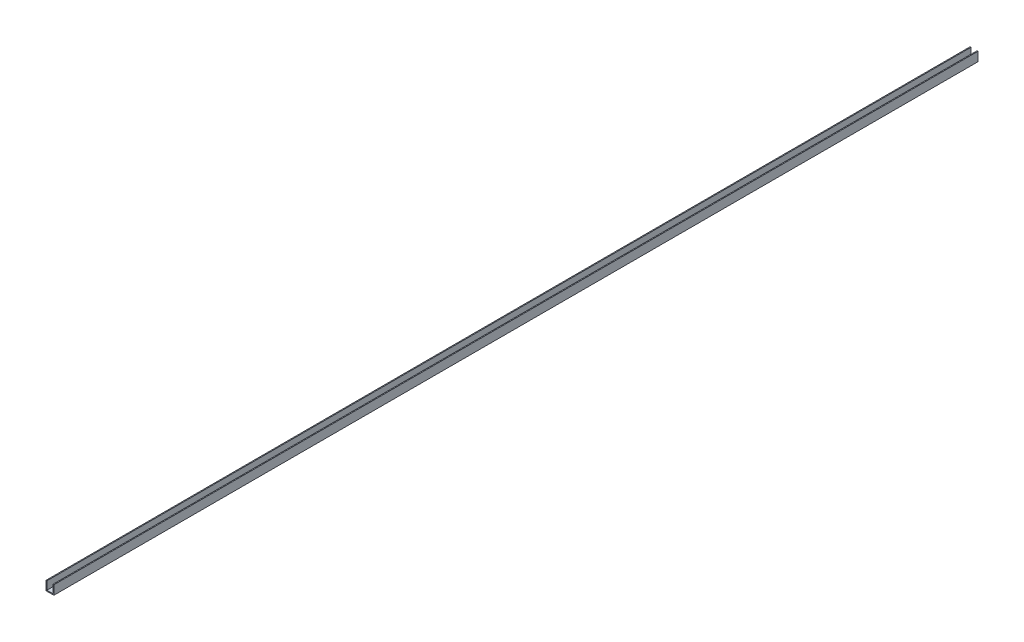
ISO-10303-21;
HEADER;
FILE_DESCRIPTION(('STEP AP214'),'2;1');
FILE_NAME('part.step','',(''),(''),'','','');
FILE_SCHEMA(('AUTOMOTIVE_DESIGN { 1 0 10303 214 1 1 1 1 }'));
ENDSEC;
DATA;
#1=APPLICATION_CONTEXT('core data for automotive mechanical design processes');
#2=APPLICATION_PROTOCOL_DEFINITION('international standard','automotive_design',2000,#1);
#3=PRODUCT_CONTEXT('',#1,'mechanical');
#4=PRODUCT('Part','Part','',(#3));
#5=PRODUCT_RELATED_PRODUCT_CATEGORY('part','',(#4));
#6=PRODUCT_DEFINITION_FORMATION('','',#4);
#7=PRODUCT_DEFINITION_CONTEXT('part definition',#1,'design');
#8=PRODUCT_DEFINITION('design','',#6,#7);
#9=PRODUCT_DEFINITION_SHAPE('','',#8);
#10=(LENGTH_UNIT() NAMED_UNIT(*) SI_UNIT(.MILLI.,.METRE.));
#11=(NAMED_UNIT(*) PLANE_ANGLE_UNIT() SI_UNIT($,.RADIAN.));
#12=(NAMED_UNIT(*) SI_UNIT($,.STERADIAN.) SOLID_ANGLE_UNIT());
#13=UNCERTAINTY_MEASURE_WITH_UNIT(LENGTH_MEASURE(1.E-05),#10,'distance_accuracy_value','');
#14=(GEOMETRIC_REPRESENTATION_CONTEXT(3) GLOBAL_UNCERTAINTY_ASSIGNED_CONTEXT((#13)) GLOBAL_UNIT_ASSIGNED_CONTEXT((#10,
#11,#12)) REPRESENTATION_CONTEXT('',''));
#15=CARTESIAN_POINT('',(0.,0.,0.));
#16=DIRECTION('',(0.,0.,1.));
#17=DIRECTION('',(1.,0.,0.));
#18=AXIS2_PLACEMENT_3D('',#15,#16,#17);
#19=CARTESIAN_POINT('',(-4.953,7.493,762.));
#20=DIRECTION('',(0.,-1.,0.));
#21=DIRECTION('',(1.,0.,0.));
#22=AXIS2_PLACEMENT_3D('',#19,#20,#21);
#23=PLANE('',#22);
#24=DIRECTION('',(-1.,0.,0.));
#25=VECTOR('',#24,1.);
#26=CARTESIAN_POINT('',(-4.953,7.493,-762.));
#27=LINE('',#26,#25);
#28=CARTESIAN_POINT('',(-4.953,7.493,-762.));
#29=VERTEX_POINT('',#28);
#30=CARTESIAN_POINT('',(-6.477,7.493,-762.));
#31=VERTEX_POINT('',#30);
#32=EDGE_CURVE('E128',#29,#31,#27,.T.);
#33=ORIENTED_EDGE('',*,*,#32,.T.);
#34=DIRECTION('',(0.,0.,-1.));
#35=VECTOR('',#34,1.);
#36=CARTESIAN_POINT('',(-6.477,7.493,762.));
#37=LINE('',#36,#35);
#38=CARTESIAN_POINT('',(-6.477,7.493,762.));
#39=VERTEX_POINT('',#38);
#40=EDGE_CURVE('E11',#39,#31,#37,.T.);
#41=ORIENTED_EDGE('',*,*,#40,.F.);
#42=DIRECTION('',(-1.,0.,0.));
#43=VECTOR('',#42,1.);
#44=CARTESIAN_POINT('',(-4.953,7.493,762.));
#45=LINE('',#44,#43);
#46=CARTESIAN_POINT('',(-4.953,7.493,762.));
#47=VERTEX_POINT('',#46);
#48=EDGE_CURVE('E142',#47,#39,#45,.T.);
#49=ORIENTED_EDGE('',*,*,#48,.F.);
#50=DIRECTION('',(0.,0.,-1.));
#51=VECTOR('',#50,1.);
#52=CARTESIAN_POINT('',(-4.953,7.493,762.));
#53=LINE('',#52,#51);
#54=EDGE_CURVE('E124',#47,#29,#53,.T.);
#55=ORIENTED_EDGE('',*,*,#54,.T.);
#56=EDGE_LOOP('',(#33,#41,#49,#55));
#57=FACE_BOUND('',#56,.T.);
#58=ADVANCED_FACE('F32',(#57),#23,.F.);
#59=CARTESIAN_POINT('',(-6.477,7.493,762.));
#60=DIRECTION('',(1.,0.,0.));
#61=DIRECTION('',(0.,1.,0.));
#62=AXIS2_PLACEMENT_3D('',#59,#60,#61);
#63=PLANE('',#62);
#64=DIRECTION('',(0.,-1.,0.));
#65=VECTOR('',#64,1.);
#66=CARTESIAN_POINT('',(-6.477,7.493,-762.));
#67=LINE('',#66,#65);
#68=CARTESIAN_POINT('',(-6.477,-7.493,-762.));
#69=VERTEX_POINT('',#68);
#70=EDGE_CURVE('E131',#31,#69,#67,.T.);
#71=ORIENTED_EDGE('',*,*,#70,.T.);
#72=DIRECTION('',(0.,0.,-1.));
#73=VECTOR('',#72,1.);
#74=CARTESIAN_POINT('',(-6.477,-7.493,762.));
#75=LINE('',#74,#73);
#76=CARTESIAN_POINT('',(-6.477,-7.493,762.));
#77=VERTEX_POINT('',#76);
#78=EDGE_CURVE('E40',#77,#69,#75,.T.);
#79=ORIENTED_EDGE('',*,*,#78,.F.);
#80=DIRECTION('',(0.,-1.,0.));
#81=VECTOR('',#80,1.);
#82=CARTESIAN_POINT('',(-6.477,7.493,762.));
#83=LINE('',#82,#81);
#84=EDGE_CURVE('E91',#39,#77,#83,.T.);
#85=ORIENTED_EDGE('',*,*,#84,.F.);
#86=ORIENTED_EDGE('',*,*,#40,.T.);
#87=EDGE_LOOP('',(#71,#79,#85,#86));
#88=FACE_BOUND('',#87,.T.);
#89=ADVANCED_FACE('F177',(#88),#63,.F.);
#90=CARTESIAN_POINT('',(-6.477,-7.493,762.));
#91=DIRECTION('',(0.,1.,0.));
#92=DIRECTION('',(-1.,0.,0.));
#93=AXIS2_PLACEMENT_3D('',#90,#91,#92);
#94=PLANE('',#93);
#95=DIRECTION('',(1.,0.,0.));
#96=VECTOR('',#95,1.);
#97=CARTESIAN_POINT('',(-6.477,-7.493,-762.));
#98=LINE('',#97,#96);
#99=CARTESIAN_POINT('',(6.477,-7.493,-762.));
#100=VERTEX_POINT('',#99);
#101=EDGE_CURVE('E133',#69,#100,#98,.T.);
#102=ORIENTED_EDGE('',*,*,#101,.T.);
#103=DIRECTION('',(0.,0.,-1.));
#104=VECTOR('',#103,1.);
#105=CARTESIAN_POINT('',(6.477,-7.493,762.));
#106=LINE('',#105,#104);
#107=CARTESIAN_POINT('',(6.477,-7.493,762.));
#108=VERTEX_POINT('',#107);
#109=EDGE_CURVE('E149',#108,#100,#106,.T.);
#110=ORIENTED_EDGE('',*,*,#109,.F.);
#111=DIRECTION('',(1.,0.,0.));
#112=VECTOR('',#111,1.);
#113=CARTESIAN_POINT('',(-6.477,-7.493,762.));
#114=LINE('',#113,#112);
#115=EDGE_CURVE('E157',#77,#108,#114,.T.);
#116=ORIENTED_EDGE('',*,*,#115,.F.);
#117=ORIENTED_EDGE('',*,*,#78,.T.);
#118=EDGE_LOOP('',(#102,#110,#116,#117));
#119=FACE_BOUND('',#118,.T.);
#120=ADVANCED_FACE('F155',(#119),#94,.F.);
#121=CARTESIAN_POINT('',(6.477,-7.493,762.));
#122=DIRECTION('',(-1.,0.,0.));
#123=DIRECTION('',(0.,-1.,0.));
#124=AXIS2_PLACEMENT_3D('',#121,#122,#123);
#125=PLANE('',#124);
#126=DIRECTION('',(0.,1.,0.));
#127=VECTOR('',#126,1.);
#128=CARTESIAN_POINT('',(6.477,-7.493,-762.));
#129=LINE('',#128,#127);
#130=CARTESIAN_POINT('',(6.477,7.493,-762.));
#131=VERTEX_POINT('',#130);
#132=EDGE_CURVE('E135',#100,#131,#129,.T.);
#133=ORIENTED_EDGE('',*,*,#132,.T.);
#134=DIRECTION('',(0.,0.,-1.));
#135=VECTOR('',#134,1.);
#136=CARTESIAN_POINT('',(6.477,7.493,762.));
#137=LINE('',#136,#135);
#138=CARTESIAN_POINT('',(6.477,7.493,762.));
#139=VERTEX_POINT('',#138);
#140=EDGE_CURVE('E146',#139,#131,#137,.T.);
#141=ORIENTED_EDGE('',*,*,#140,.F.);
#142=DIRECTION('',(0.,1.,0.));
#143=VECTOR('',#142,1.);
#144=CARTESIAN_POINT('',(6.477,-7.493,762.));
#145=LINE('',#144,#143);
#146=EDGE_CURVE('E169',#108,#139,#145,.T.);
#147=ORIENTED_EDGE('',*,*,#146,.F.);
#148=ORIENTED_EDGE('',*,*,#109,.T.);
#149=EDGE_LOOP('',(#133,#141,#147,#148));
#150=FACE_BOUND('',#149,.T.);
#151=ADVANCED_FACE('F165',(#150),#125,.F.);
#152=CARTESIAN_POINT('',(6.477,7.493,762.));
#153=DIRECTION('',(0.,-1.,0.));
#154=DIRECTION('',(1.,0.,0.));
#155=AXIS2_PLACEMENT_3D('',#152,#153,#154);
#156=PLANE('',#155);
#157=DIRECTION('',(-1.,0.,0.));
#158=VECTOR('',#157,1.);
#159=CARTESIAN_POINT('',(6.477,7.493,-762.));
#160=LINE('',#159,#158);
#161=CARTESIAN_POINT('',(4.953,7.493,-762.));
#162=VERTEX_POINT('',#161);
#163=EDGE_CURVE('E137',#131,#162,#160,.T.);
#164=ORIENTED_EDGE('',*,*,#163,.T.);
#165=DIRECTION('',(0.,0.,-1.));
#166=VECTOR('',#165,1.);
#167=CARTESIAN_POINT('',(4.953,7.493,762.));
#168=LINE('',#167,#166);
#169=CARTESIAN_POINT('',(4.953,7.493,762.));
#170=VERTEX_POINT('',#169);
#171=EDGE_CURVE('E119',#170,#162,#168,.T.);
#172=ORIENTED_EDGE('',*,*,#171,.F.);
#173=DIRECTION('',(-1.,0.,0.));
#174=VECTOR('',#173,1.);
#175=CARTESIAN_POINT('',(6.477,7.493,762.));
#176=LINE('',#175,#174);
#177=EDGE_CURVE('E110',#139,#170,#176,.T.);
#178=ORIENTED_EDGE('',*,*,#177,.F.);
#179=ORIENTED_EDGE('',*,*,#140,.T.);
#180=EDGE_LOOP('',(#164,#172,#178,#179));
#181=FACE_BOUND('',#180,.T.);
#182=ADVANCED_FACE('F168',(#181),#156,.F.);
#183=CARTESIAN_POINT('',(4.953,7.493,762.));
#184=DIRECTION('',(1.,0.,0.));
#185=DIRECTION('',(0.,1.,0.));
#186=AXIS2_PLACEMENT_3D('',#183,#184,#185);
#187=PLANE('',#186);
#188=DIRECTION('',(0.,-1.,0.));
#189=VECTOR('',#188,1.);
#190=CARTESIAN_POINT('',(4.953,7.493,-762.));
#191=LINE('',#190,#189);
#192=CARTESIAN_POINT('',(4.953,-5.969,-762.));
#193=VERTEX_POINT('',#192);
#194=EDGE_CURVE('E118',#162,#193,#191,.T.);
#195=ORIENTED_EDGE('',*,*,#194,.T.);
#196=DIRECTION('',(0.,0.,-1.));
#197=VECTOR('',#196,1.);
#198=CARTESIAN_POINT('',(4.953,-5.969,762.));
#199=LINE('',#198,#197);
#200=CARTESIAN_POINT('',(4.953,-5.969,762.));
#201=VERTEX_POINT('',#200);
#202=EDGE_CURVE('E115',#201,#193,#199,.T.);
#203=ORIENTED_EDGE('',*,*,#202,.F.);
#204=DIRECTION('',(0.,-1.,0.));
#205=VECTOR('',#204,1.);
#206=CARTESIAN_POINT('',(4.953,7.493,762.));
#207=LINE('',#206,#205);
#208=EDGE_CURVE('E104',#170,#201,#207,.T.);
#209=ORIENTED_EDGE('',*,*,#208,.F.);
#210=ORIENTED_EDGE('',*,*,#171,.T.);
#211=EDGE_LOOP('',(#195,#203,#209,#210));
#212=FACE_BOUND('',#211,.T.);
#213=ADVANCED_FACE('F116',(#212),#187,.F.);
#214=CARTESIAN_POINT('',(4.953,-5.969,762.));
#215=DIRECTION('',(0.,-1.,0.));
#216=DIRECTION('',(1.,0.,0.));
#217=AXIS2_PLACEMENT_3D('',#214,#215,#216);
#218=PLANE('',#217);
#219=DIRECTION('',(-1.,0.,0.));
#220=VECTOR('',#219,1.);
#221=CARTESIAN_POINT('',(4.953,-5.969,-762.));
#222=LINE('',#221,#220);
#223=CARTESIAN_POINT('',(-4.953,-5.969,-762.));
#224=VERTEX_POINT('',#223);
#225=EDGE_CURVE('E77',#193,#224,#222,.T.);
#226=ORIENTED_EDGE('',*,*,#225,.T.);
#227=DIRECTION('',(0.,0.,-1.));
#228=VECTOR('',#227,1.);
#229=CARTESIAN_POINT('',(-4.953,-5.969,762.));
#230=LINE('',#229,#228);
#231=CARTESIAN_POINT('',(-4.953,-5.969,762.));
#232=VERTEX_POINT('',#231);
#233=EDGE_CURVE('E120',#232,#224,#230,.T.);
#234=ORIENTED_EDGE('',*,*,#233,.F.);
#235=DIRECTION('',(-1.,0.,0.));
#236=VECTOR('',#235,1.);
#237=CARTESIAN_POINT('',(4.953,-5.969,762.));
#238=LINE('',#237,#236);
#239=EDGE_CURVE('E108',#201,#232,#238,.T.);
#240=ORIENTED_EDGE('',*,*,#239,.F.);
#241=ORIENTED_EDGE('',*,*,#202,.T.);
#242=EDGE_LOOP('',(#226,#234,#240,#241));
#243=FACE_BOUND('',#242,.T.);
#244=ADVANCED_FACE('F122',(#243),#218,.F.);
#245=CARTESIAN_POINT('',(-4.953,-5.969,762.));
#246=DIRECTION('',(-1.,0.,0.));
#247=DIRECTION('',(0.,-1.,0.));
#248=AXIS2_PLACEMENT_3D('',#245,#246,#247);
#249=PLANE('',#248);
#250=DIRECTION('',(0.,1.,0.));
#251=VECTOR('',#250,1.);
#252=CARTESIAN_POINT('',(-4.953,-5.969,-762.));
#253=LINE('',#252,#251);
#254=EDGE_CURVE('E83',#224,#29,#253,.T.);
#255=ORIENTED_EDGE('',*,*,#254,.T.);
#256=ORIENTED_EDGE('',*,*,#54,.F.);
#257=DIRECTION('',(0.,1.,0.));
#258=VECTOR('',#257,1.);
#259=CARTESIAN_POINT('',(-4.953,-5.969,762.));
#260=LINE('',#259,#258);
#261=EDGE_CURVE('E48',#232,#47,#260,.T.);
#262=ORIENTED_EDGE('',*,*,#261,.F.);
#263=ORIENTED_EDGE('',*,*,#233,.T.);
#264=EDGE_LOOP('',(#255,#256,#262,#263));
#265=FACE_BOUND('',#264,.T.);
#266=ADVANCED_FACE('F193',(#265),#249,.F.);
#267=CARTESIAN_POINT('',(0.,0.,762.));
#268=DIRECTION('',(0.,0.,1.));
#269=DIRECTION('',(1.,0.,0.));
#270=AXIS2_PLACEMENT_3D('',#267,#268,#269);
#271=PLANE('',#270);
#272=ORIENTED_EDGE('',*,*,#48,.T.);
#273=ORIENTED_EDGE('',*,*,#84,.T.);
#274=ORIENTED_EDGE('',*,*,#115,.T.);
#275=ORIENTED_EDGE('',*,*,#146,.T.);
#276=ORIENTED_EDGE('',*,*,#177,.T.);
#277=ORIENTED_EDGE('',*,*,#208,.T.);
#278=ORIENTED_EDGE('',*,*,#239,.T.);
#279=ORIENTED_EDGE('',*,*,#261,.T.);
#280=EDGE_LOOP('',(#272,#273,#274,#275,#276,#277,#278,#279));
#281=FACE_BOUND('',#280,.T.);
#282=ADVANCED_FACE('F106',(#281),#271,.T.);
#283=CARTESIAN_POINT('',(0.,0.,-762.));
#284=DIRECTION('',(0.,0.,1.));
#285=DIRECTION('',(1.,0.,0.));
#286=AXIS2_PLACEMENT_3D('',#283,#284,#285);
#287=PLANE('',#286);
#288=ORIENTED_EDGE('',*,*,#32,.F.);
#289=ORIENTED_EDGE('',*,*,#254,.F.);
#290=ORIENTED_EDGE('',*,*,#225,.F.);
#291=ORIENTED_EDGE('',*,*,#194,.F.);
#292=ORIENTED_EDGE('',*,*,#163,.F.);
#293=ORIENTED_EDGE('',*,*,#132,.F.);
#294=ORIENTED_EDGE('',*,*,#101,.F.);
#295=ORIENTED_EDGE('',*,*,#70,.F.);
#296=EDGE_LOOP('',(#288,#289,#290,#291,#292,#293,#294,#295));
#297=FACE_BOUND('',#296,.T.);
#298=ADVANCED_FACE('F161',(#297),#287,.F.);
#299=CLOSED_SHELL('',(#58,#89,#120,#151,#182,#213,#244,#266,#282,#298));
#300=MANIFOLD_SOLID_BREP('B2',#299);
#301=ADVANCED_BREP_SHAPE_REPRESENTATION('',(#18,#300),#14);
#302=SHAPE_DEFINITION_REPRESENTATION(#9,#301);
ENDSEC;
END-ISO-10303-21;
